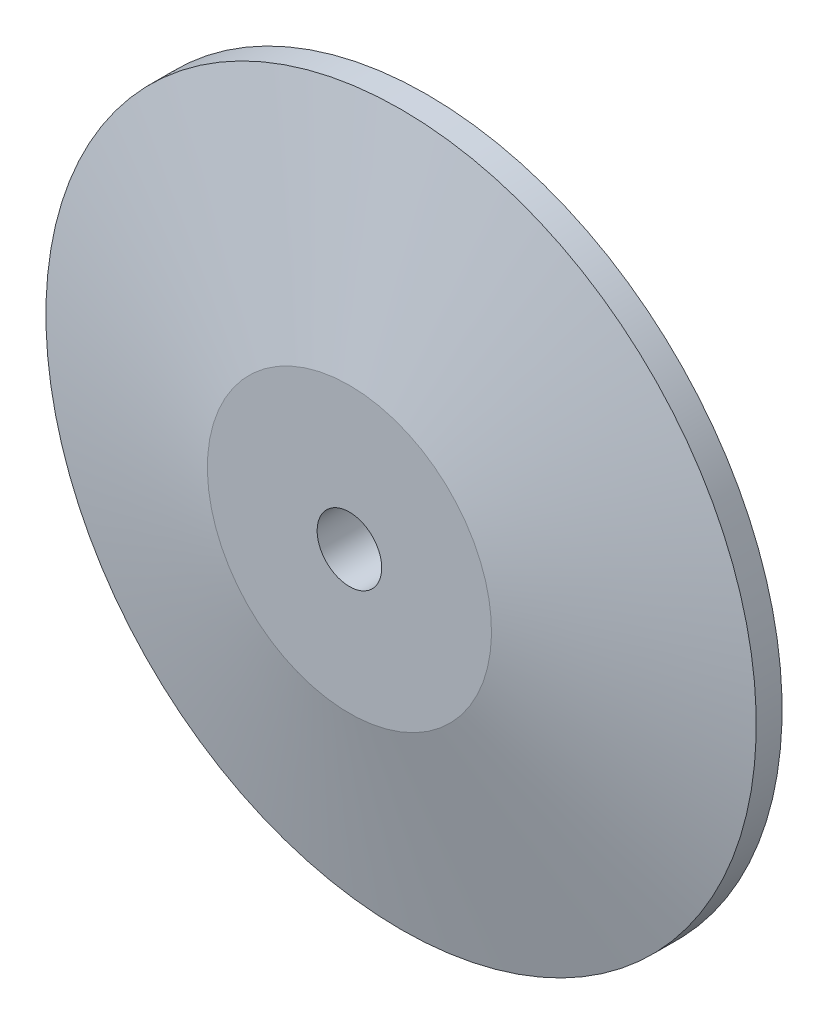
ISO-10303-21;
HEADER;
FILE_DESCRIPTION(('STEP AP214'),'2;1');
FILE_NAME('part.step','',(''),(''),'','','');
FILE_SCHEMA(('AUTOMOTIVE_DESIGN { 1 0 10303 214 1 1 1 1 }'));
ENDSEC;
DATA;
#1=APPLICATION_CONTEXT('core data for automotive mechanical design processes');
#2=APPLICATION_PROTOCOL_DEFINITION('international standard','automotive_design',2000,#1);
#3=PRODUCT_CONTEXT('',#1,'mechanical');
#4=PRODUCT('Part','Part','',(#3));
#5=PRODUCT_RELATED_PRODUCT_CATEGORY('part','',(#4));
#6=PRODUCT_DEFINITION_FORMATION('','',#4);
#7=PRODUCT_DEFINITION_CONTEXT('part definition',#1,'design');
#8=PRODUCT_DEFINITION('design','',#6,#7);
#9=PRODUCT_DEFINITION_SHAPE('','',#8);
#10=(LENGTH_UNIT() NAMED_UNIT(*) SI_UNIT(.MILLI.,.METRE.));
#11=(NAMED_UNIT(*) PLANE_ANGLE_UNIT() SI_UNIT($,.RADIAN.));
#12=(NAMED_UNIT(*) SI_UNIT($,.STERADIAN.) SOLID_ANGLE_UNIT());
#13=UNCERTAINTY_MEASURE_WITH_UNIT(LENGTH_MEASURE(1.E-05),#10,'distance_accuracy_value','');
#14=(GEOMETRIC_REPRESENTATION_CONTEXT(3) GLOBAL_UNCERTAINTY_ASSIGNED_CONTEXT((#13)) GLOBAL_UNIT_ASSIGNED_CONTEXT((#10,
#11,#12)) REPRESENTATION_CONTEXT('',''));
#15=CARTESIAN_POINT('',(0.,0.,0.));
#16=DIRECTION('',(0.,0.,1.));
#17=DIRECTION('',(1.,0.,0.));
#18=AXIS2_PLACEMENT_3D('',#15,#16,#17);
#19=CARTESIAN_POINT('',(36.4709378575965,186.476934019054,-14.8722547438914));
#20=DIRECTION('',(-3.66535646968411E-06,-3.87598978884442E-06,-0.999999999985771));
#21=DIRECTION('',(0.,0.999999999992488,-3.87598978887046E-06));
#22=AXIS2_PLACEMENT_3D('',#19,#20,#21);
#23=CONICAL_SURFACE('',#22,27.5000000746069,1.33296039933748);
#24=CARTESIAN_POINT('',(36.4709376996132,186.476934019053,-14.8722547619775));
#25=DIRECTION('',(3.66535646875588E-06,3.87598978754002E-06,0.999999999985771));
#26=DIRECTION('',(0.,-0.999999999992488,3.87598978756606E-06));
#27=AXIS2_PLACEMENT_3D('',#24,#25,#26);
#28=CIRCLE('',#27,27.5000000000001);
#29=CARTESIAN_POINT('',(36.4709376996132,158.97693401926,-14.8721481722584));
#30=VERTEX_POINT('',#29);
#31=EDGE_CURVE('E32',#30,#30,#28,.F.);
#32=ORIENTED_EDGE('',*,*,#31,.F.);
#33=EDGE_LOOP('',(#32));
#34=FACE_BOUND('',#33,.T.);
#35=CARTESIAN_POINT('',(36.4709525190224,186.476949523013,-10.8722547258619));
#36=DIRECTION('',(-3.66535646968411E-06,-3.87598978884442E-06,-0.999999999985771));
#37=DIRECTION('',(0.,0.999999999992488,-3.87598978887046E-06));
#38=AXIS2_PLACEMENT_3D('',#35,#36,#37);
#39=CIRCLE('',#38,10.999999999998);
#40=CARTESIAN_POINT('',(36.4709525190224,197.476949522928,-10.8722973617496));
#41=VERTEX_POINT('',#40);
#42=EDGE_CURVE('E17',#41,#41,#39,.F.);
#43=ORIENTED_EDGE('',*,*,#42,.F.);
#44=EDGE_LOOP('',(#43));
#45=FACE_BOUND('',#44,.T.);
#46=ADVANCED_FACE('F14',(#34,#45),#23,.T.);
#47=CARTESIAN_POINT('',(25.4699523084676,186.476969105068,-10.8722144033507));
#48=DIRECTION('',(3.66535646875588E-06,3.87598978754002E-06,0.999999999985771));
#49=DIRECTION('',(0.,-0.999999999992488,3.87598978756606E-06));
#50=AXIS2_PLACEMENT_3D('',#47,#48,#49);
#51=PLANE('',#50);
#52=CARTESIAN_POINT('',(36.4709532587942,186.47694952301,-10.8722547258647));
#53=DIRECTION('',(3.66535646875588E-06,3.87598978754002E-06,0.999999999985771));
#54=DIRECTION('',(0.,-0.999999999992488,3.87598978756606E-06));
#55=AXIS2_PLACEMENT_3D('',#52,#53,#54);
#56=CIRCLE('',#55,2.50000000000012);
#57=CARTESIAN_POINT('',(36.4709532587942,183.976949523029,-10.8722450358903));
#58=VERTEX_POINT('',#57);
#59=EDGE_CURVE('E26',#58,#58,#56,.F.);
#60=ORIENTED_EDGE('',*,*,#59,.T.);
#61=EDGE_LOOP('',(#60));
#62=FACE_BOUND('',#61,.T.);
#63=ORIENTED_EDGE('',*,*,#42,.T.);
#64=EDGE_LOOP('',(#63));
#65=FACE_BOUND('',#64,.T.);
#66=ADVANCED_FACE('F41',(#62,#65),#51,.T.);
#67=CARTESIAN_POINT('',(36.4709285362222,186.476924329079,-17.372254725769));
#68=DIRECTION('',(3.66535646875588E-06,3.87598978754002E-06,0.999999999985771));
#69=DIRECTION('',(0.,-0.999999999992488,3.87598978756606E-06));
#70=AXIS2_PLACEMENT_3D('',#67,#68,#69);
#71=CYLINDRICAL_SURFACE('',#70,27.5000000000001);
#72=CARTESIAN_POINT('',(36.4709303689004,186.476926267074,-16.8722547257761));
#73=DIRECTION('',(3.66535646875588E-06,3.87598978754002E-06,0.999999999985771));
#74=DIRECTION('',(0.,-0.999999999992488,3.87598978756606E-06));
#75=AXIS2_PLACEMENT_3D('',#72,#73,#74);
#76=CIRCLE('',#75,27.5000000000001);
#77=CARTESIAN_POINT('',(36.4709303689004,158.97692626728,-16.872148136057));
#78=VERTEX_POINT('',#77);
#79=EDGE_CURVE('E21',#78,#78,#76,.F.);
#80=ORIENTED_EDGE('',*,*,#79,.F.);
#81=EDGE_LOOP('',(#80));
#82=FACE_BOUND('',#81,.T.);
#83=ORIENTED_EDGE('',*,*,#31,.T.);
#84=EDGE_LOOP('',(#83));
#85=FACE_BOUND('',#84,.T.);
#86=ADVANCED_FACE('F49',(#82,#85),#71,.T.);
#87=CARTESIAN_POINT('',(36.4709367646901,186.476932081056,-15.3722547258007));
#88=DIRECTION('',(3.66535646875588E-06,3.87598978754002E-06,0.999999999985771));
#89=DIRECTION('',(0.,-0.999999999992488,3.87598978756606E-06));
#90=AXIS2_PLACEMENT_3D('',#87,#88,#89);
#91=CYLINDRICAL_SURFACE('',#90,2.50000000000012);
#92=CARTESIAN_POINT('',(36.4709312666554,186.476926267071,-16.8722547257794));
#93=DIRECTION('',(3.66535646875588E-06,3.87598978754002E-06,0.999999999985771));
#94=DIRECTION('',(0.,-0.999999999992488,3.87598978756606E-06));
#95=AXIS2_PLACEMENT_3D('',#92,#93,#94);
#96=CIRCLE('',#95,2.50000000000012);
#97=CARTESIAN_POINT('',(36.4709312666554,183.97692626709,-16.8722450358049));
#98=VERTEX_POINT('',#97);
#99=EDGE_CURVE('E9',#98,#98,#96,.T.);
#100=ORIENTED_EDGE('',*,*,#99,.F.);
#101=EDGE_LOOP('',(#100));
#102=FACE_BOUND('',#101,.T.);
#103=ORIENTED_EDGE('',*,*,#59,.F.);
#104=EDGE_LOOP('',(#103));
#105=FACE_BOUND('',#104,.T.);
#106=ADVANCED_FACE('F52',(#102,#105),#91,.F.);
#107=CARTESIAN_POINT('',(63.9719303687156,186.476926266781,-16.8723555267443));
#108=DIRECTION('',(-3.66535646875588E-06,-3.87598978754002E-06,-0.999999999985771));
#109=DIRECTION('',(0.,0.999999999992488,-3.87598978756606E-06));
#110=AXIS2_PLACEMENT_3D('',#107,#108,#109);
#111=PLANE('',#110);
#112=ORIENTED_EDGE('',*,*,#99,.T.);
#113=EDGE_LOOP('',(#112));
#114=FACE_BOUND('',#113,.T.);
#115=ORIENTED_EDGE('',*,*,#79,.T.);
#116=EDGE_LOOP('',(#115));
#117=FACE_BOUND('',#116,.T.);
#118=ADVANCED_FACE('F50',(#114,#117),#111,.T.);
#119=CLOSED_SHELL('',(#46,#66,#86,#106,#118));
#120=MANIFOLD_SOLID_BREP('B1',#119);
#121=ADVANCED_BREP_SHAPE_REPRESENTATION('',(#18,#120),#14);
#122=SHAPE_DEFINITION_REPRESENTATION(#9,#121);
ENDSEC;
END-ISO-10303-21;
